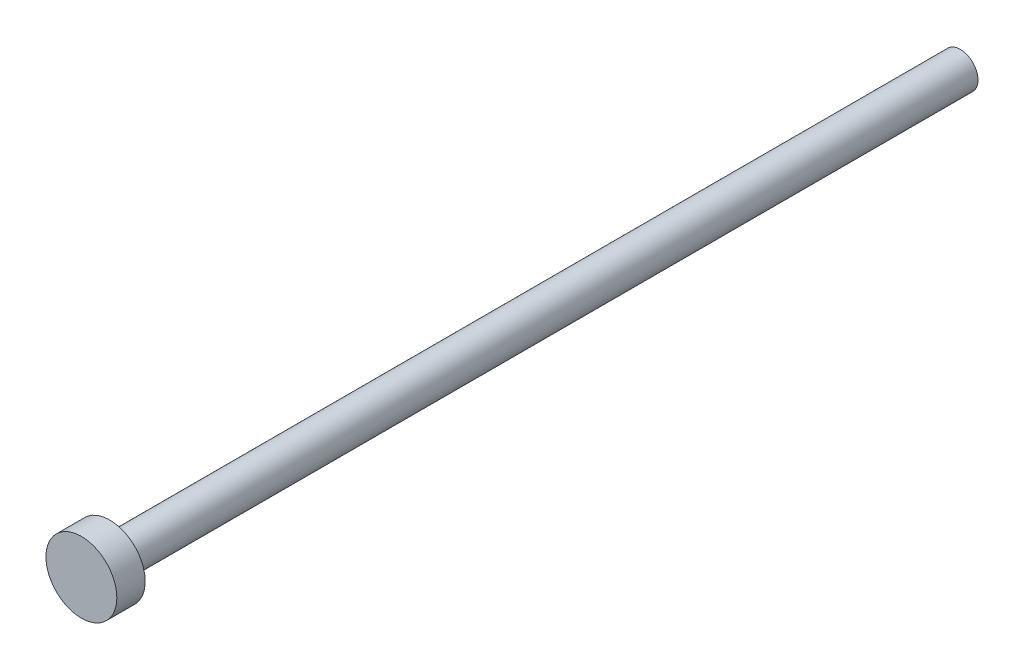
ISO-10303-21;
HEADER;
FILE_DESCRIPTION(('STEP AP214'),'2;1');
FILE_NAME('part.step','',(''),(''),'','','');
FILE_SCHEMA(('AUTOMOTIVE_DESIGN { 1 0 10303 214 1 1 1 1 }'));
ENDSEC;
DATA;
#1=APPLICATION_CONTEXT('core data for automotive mechanical design processes');
#2=APPLICATION_PROTOCOL_DEFINITION('international standard','automotive_design',2000,#1);
#3=PRODUCT_CONTEXT('',#1,'mechanical');
#4=PRODUCT('Part','Part','',(#3));
#5=PRODUCT_RELATED_PRODUCT_CATEGORY('part','',(#4));
#6=PRODUCT_DEFINITION_FORMATION('','',#4);
#7=PRODUCT_DEFINITION_CONTEXT('part definition',#1,'design');
#8=PRODUCT_DEFINITION('design','',#6,#7);
#9=PRODUCT_DEFINITION_SHAPE('','',#8);
#10=(LENGTH_UNIT() NAMED_UNIT(*) SI_UNIT(.MILLI.,.METRE.));
#11=(NAMED_UNIT(*) PLANE_ANGLE_UNIT() SI_UNIT($,.RADIAN.));
#12=(NAMED_UNIT(*) SI_UNIT($,.STERADIAN.) SOLID_ANGLE_UNIT());
#13=UNCERTAINTY_MEASURE_WITH_UNIT(LENGTH_MEASURE(1.E-05),#10,'distance_accuracy_value','');
#14=(GEOMETRIC_REPRESENTATION_CONTEXT(3) GLOBAL_UNCERTAINTY_ASSIGNED_CONTEXT((#13)) GLOBAL_UNIT_ASSIGNED_CONTEXT((#10,
#11,#12)) REPRESENTATION_CONTEXT('',''));
#15=CARTESIAN_POINT('',(0.,0.,0.));
#16=DIRECTION('',(0.,0.,1.));
#17=DIRECTION('',(1.,0.,0.));
#18=AXIS2_PLACEMENT_3D('',#15,#16,#17);
#19=CARTESIAN_POINT('',(0.,0.,1.));
#20=DIRECTION('',(0.,0.,-1.));
#21=DIRECTION('',(-1.,0.,0.));
#22=AXIS2_PLACEMENT_3D('',#19,#20,#21);
#23=CYLINDRICAL_SURFACE('',#22,1.25);
#24=CARTESIAN_POINT('',(0.,0.,1.));
#25=DIRECTION('',(0.,0.,1.));
#26=DIRECTION('',(1.,0.,0.));
#27=AXIS2_PLACEMENT_3D('',#24,#25,#26);
#28=CIRCLE('',#27,1.25);
#29=CARTESIAN_POINT('',(1.25,0.,1.));
#30=VERTEX_POINT('',#29);
#31=EDGE_CURVE('E44',#30,#30,#28,.T.);
#32=ORIENTED_EDGE('',*,*,#31,.F.);
#33=EDGE_LOOP('',(#32));
#34=FACE_BOUND('',#33,.T.);
#35=CARTESIAN_POINT('',(0.,0.,0.));
#36=DIRECTION('',(0.,0.,1.));
#37=DIRECTION('',(1.,0.,0.));
#38=AXIS2_PLACEMENT_3D('',#35,#36,#37);
#39=CIRCLE('',#38,1.25);
#40=CARTESIAN_POINT('',(1.25,0.,0.));
#41=VERTEX_POINT('',#40);
#42=EDGE_CURVE('E39',#41,#41,#39,.T.);
#43=ORIENTED_EDGE('',*,*,#42,.T.);
#44=EDGE_LOOP('',(#43));
#45=FACE_BOUND('',#44,.T.);
#46=ADVANCED_FACE('F36',(#34,#45),#23,.T.);
#47=CARTESIAN_POINT('',(0.,0.,1.));
#48=DIRECTION('',(0.,0.,1.));
#49=DIRECTION('',(1.,0.,0.));
#50=AXIS2_PLACEMENT_3D('',#47,#48,#49);
#51=PLANE('',#50);
#52=ORIENTED_EDGE('',*,*,#31,.T.);
#53=EDGE_LOOP('',(#52));
#54=FACE_BOUND('',#53,.T.);
#55=ADVANCED_FACE('F64',(#54),#51,.T.);
#56=CARTESIAN_POINT('',(0.,0.,0.));
#57=DIRECTION('',(0.,0.,1.));
#58=DIRECTION('',(1.,0.,0.));
#59=AXIS2_PLACEMENT_3D('',#56,#57,#58);
#60=PLANE('',#59);
#61=CARTESIAN_POINT('',(0.,0.,0.));
#62=DIRECTION('',(0.,0.,-1.));
#63=DIRECTION('',(-1.,0.,0.));
#64=AXIS2_PLACEMENT_3D('',#61,#62,#63);
#65=CIRCLE('',#64,0.625);
#66=CARTESIAN_POINT('',(-0.625,0.,0.));
#67=VERTEX_POINT('',#66);
#68=EDGE_CURVE('E10',#67,#67,#65,.T.);
#69=ORIENTED_EDGE('',*,*,#68,.F.);
#70=EDGE_LOOP('',(#69));
#71=FACE_BOUND('',#70,.T.);
#72=ORIENTED_EDGE('',*,*,#42,.F.);
#73=EDGE_LOOP('',(#72));
#74=FACE_BOUND('',#73,.T.);
#75=ADVANCED_FACE('F61',(#71,#74),#60,.F.);
#76=CARTESIAN_POINT('',(0.,0.,-30.));
#77=DIRECTION('',(0.,0.,1.));
#78=DIRECTION('',(1.,0.,0.));
#79=AXIS2_PLACEMENT_3D('',#76,#77,#78);
#80=CYLINDRICAL_SURFACE('',#79,0.625);
#81=CARTESIAN_POINT('',(0.,0.,-30.));
#82=DIRECTION('',(0.,0.,-1.));
#83=DIRECTION('',(-1.,0.,0.));
#84=AXIS2_PLACEMENT_3D('',#81,#82,#83);
#85=CIRCLE('',#84,0.625);
#86=CARTESIAN_POINT('',(-0.625,0.,-30.));
#87=VERTEX_POINT('',#86);
#88=EDGE_CURVE('E51',#87,#87,#85,.T.);
#89=ORIENTED_EDGE('',*,*,#88,.F.);
#90=EDGE_LOOP('',(#89));
#91=FACE_BOUND('',#90,.T.);
#92=ORIENTED_EDGE('',*,*,#68,.T.);
#93=EDGE_LOOP('',(#92));
#94=FACE_BOUND('',#93,.T.);
#95=ADVANCED_FACE('F63',(#91,#94),#80,.T.);
#96=CARTESIAN_POINT('',(0.,0.,-30.));
#97=DIRECTION('',(0.,0.,-1.));
#98=DIRECTION('',(-1.,0.,0.));
#99=AXIS2_PLACEMENT_3D('',#96,#97,#98);
#100=PLANE('',#99);
#101=ORIENTED_EDGE('',*,*,#88,.T.);
#102=EDGE_LOOP('',(#101));
#103=FACE_BOUND('',#102,.T.);
#104=ADVANCED_FACE('F70',(#103),#100,.T.);
#105=CLOSED_SHELL('',(#46,#55,#75,#95,#104));
#106=MANIFOLD_SOLID_BREP('B2',#105);
#107=ADVANCED_BREP_SHAPE_REPRESENTATION('',(#18,#106),#14);
#108=SHAPE_DEFINITION_REPRESENTATION(#9,#107);
ENDSEC;
END-ISO-10303-21;
